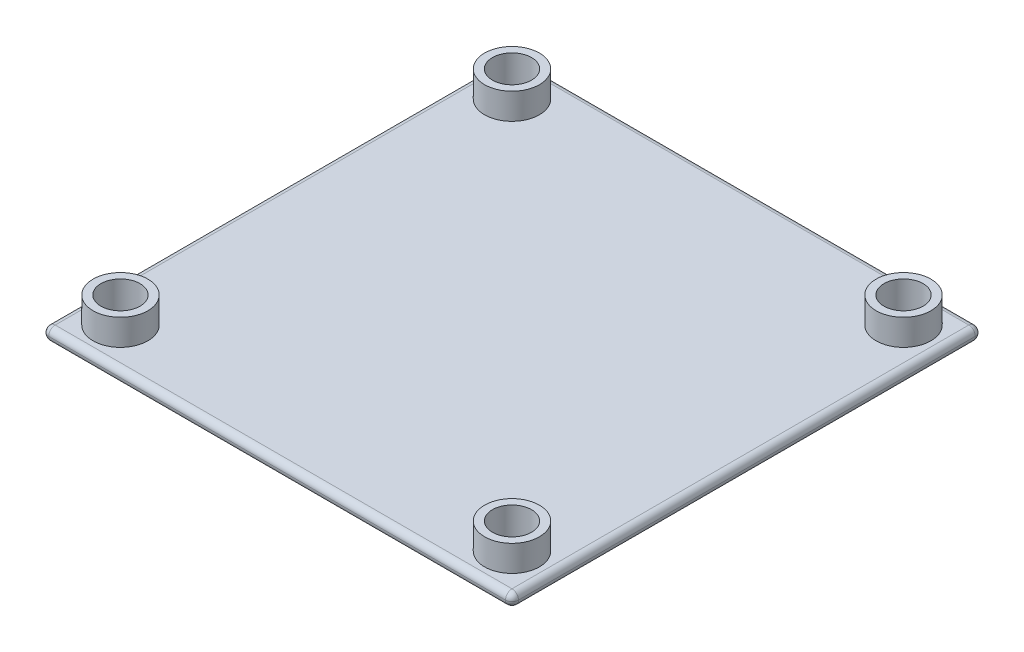
ISO-10303-21;
HEADER;
FILE_DESCRIPTION(('STEP AP214'),'2;1');
FILE_NAME('part.step','',(''),(''),'','','');
FILE_SCHEMA(('AUTOMOTIVE_DESIGN { 1 0 10303 214 1 1 1 1 }'));
ENDSEC;
DATA;
#1=APPLICATION_CONTEXT('core data for automotive mechanical design processes');
#2=APPLICATION_PROTOCOL_DEFINITION('international standard','automotive_design',2000,#1);
#3=PRODUCT_CONTEXT('',#1,'mechanical');
#4=PRODUCT('Part','Part','',(#3));
#5=PRODUCT_RELATED_PRODUCT_CATEGORY('part','',(#4));
#6=PRODUCT_DEFINITION_FORMATION('','',#4);
#7=PRODUCT_DEFINITION_CONTEXT('part definition',#1,'design');
#8=PRODUCT_DEFINITION('design','',#6,#7);
#9=PRODUCT_DEFINITION_SHAPE('','',#8);
#10=(LENGTH_UNIT() NAMED_UNIT(*) SI_UNIT(.MILLI.,.METRE.));
#11=(NAMED_UNIT(*) PLANE_ANGLE_UNIT() SI_UNIT($,.RADIAN.));
#12=(NAMED_UNIT(*) SI_UNIT($,.STERADIAN.) SOLID_ANGLE_UNIT());
#13=UNCERTAINTY_MEASURE_WITH_UNIT(LENGTH_MEASURE(1.E-05),#10,'distance_accuracy_value','');
#14=(GEOMETRIC_REPRESENTATION_CONTEXT(3) GLOBAL_UNCERTAINTY_ASSIGNED_CONTEXT((#13)) GLOBAL_UNIT_ASSIGNED_CONTEXT((#10,
#11,#12)) REPRESENTATION_CONTEXT('',''));
#15=CARTESIAN_POINT('',(0.,0.,0.));
#16=DIRECTION('',(0.,0.,1.));
#17=DIRECTION('',(1.,0.,0.));
#18=AXIS2_PLACEMENT_3D('',#15,#16,#17);
#19=CARTESIAN_POINT('',(0.,1.,0.));
#20=DIRECTION('',(0.,-1.,0.));
#21=DIRECTION('',(0.,0.,-1.));
#22=AXIS2_PLACEMENT_3D('',#19,#20,#21);
#23=PLANE('',#22);
#24=CARTESIAN_POINT('',(15.,1.,-15.));
#25=DIRECTION('',(0.,-1.,0.));
#26=DIRECTION('',(0.,0.,-1.));
#27=AXIS2_PLACEMENT_3D('',#24,#25,#26);
#28=CIRCLE('',#27,2.1);
#29=CARTESIAN_POINT('',(15.,1.,-17.1));
#30=VERTEX_POINT('',#29);
#31=EDGE_CURVE('E43',#30,#30,#28,.F.);
#32=ORIENTED_EDGE('',*,*,#31,.F.);
#33=EDGE_LOOP('',(#32));
#34=FACE_BOUND('',#33,.T.);
#35=CARTESIAN_POINT('',(-15.,1.,15.));
#36=DIRECTION('',(0.,-1.,0.));
#37=DIRECTION('',(0.,0.,-1.));
#38=AXIS2_PLACEMENT_3D('',#35,#36,#37);
#39=CIRCLE('',#38,2.1);
#40=CARTESIAN_POINT('',(-15.,1.,12.9));
#41=VERTEX_POINT('',#40);
#42=EDGE_CURVE('E142',#41,#41,#39,.F.);
#43=ORIENTED_EDGE('',*,*,#42,.F.);
#44=EDGE_LOOP('',(#43));
#45=FACE_BOUND('',#44,.T.);
#46=DIRECTION('',(0.,0.,-1.));
#47=VECTOR('',#46,1.);
#48=CARTESIAN_POINT('',(17.5,1.,0.));
#49=LINE('',#48,#47);
#50=CARTESIAN_POINT('',(17.5,1.,17.5));
#51=VERTEX_POINT('',#50);
#52=CARTESIAN_POINT('',(17.5,1.,-17.5));
#53=VERTEX_POINT('',#52);
#54=EDGE_CURVE('E213',#51,#53,#49,.T.);
#55=ORIENTED_EDGE('',*,*,#54,.T.);
#56=DIRECTION('',(-1.,0.,0.));
#57=VECTOR('',#56,1.);
#58=CARTESIAN_POINT('',(0.,1.,-17.5));
#59=LINE('',#58,#57);
#60=CARTESIAN_POINT('',(-17.5,1.,-17.5));
#61=VERTEX_POINT('',#60);
#62=EDGE_CURVE('E117',#53,#61,#59,.T.);
#63=ORIENTED_EDGE('',*,*,#62,.T.);
#64=DIRECTION('',(0.,0.,1.));
#65=VECTOR('',#64,1.);
#66=CARTESIAN_POINT('',(-17.5,1.,0.));
#67=LINE('',#66,#65);
#68=CARTESIAN_POINT('',(-17.5,1.,17.5));
#69=VERTEX_POINT('',#68);
#70=EDGE_CURVE('E94',#61,#69,#67,.T.);
#71=ORIENTED_EDGE('',*,*,#70,.T.);
#72=DIRECTION('',(1.,0.,0.));
#73=VECTOR('',#72,1.);
#74=CARTESIAN_POINT('',(0.,1.,17.5));
#75=LINE('',#74,#73);
#76=EDGE_CURVE('E334',#69,#51,#75,.T.);
#77=ORIENTED_EDGE('',*,*,#76,.T.);
#78=EDGE_LOOP('',(#55,#63,#71,#77));
#79=FACE_BOUND('',#78,.T.);
#80=CARTESIAN_POINT('',(-15.,1.,-15.));
#81=DIRECTION('',(0.,-1.,0.));
#82=DIRECTION('',(0.,0.,-1.));
#83=AXIS2_PLACEMENT_3D('',#80,#81,#82);
#84=CIRCLE('',#83,2.1);
#85=CARTESIAN_POINT('',(-15.,1.,-17.1));
#86=VERTEX_POINT('',#85);
#87=EDGE_CURVE('E200',#86,#86,#84,.F.);
#88=ORIENTED_EDGE('',*,*,#87,.F.);
#89=EDGE_LOOP('',(#88));
#90=FACE_BOUND('',#89,.T.);
#91=CARTESIAN_POINT('',(15.,1.,15.));
#92=DIRECTION('',(0.,-1.,0.));
#93=DIRECTION('',(0.,0.,-1.));
#94=AXIS2_PLACEMENT_3D('',#91,#92,#93);
#95=CIRCLE('',#94,2.1);
#96=CARTESIAN_POINT('',(15.,1.,12.9));
#97=VERTEX_POINT('',#96);
#98=EDGE_CURVE('E11',#97,#97,#95,.F.);
#99=ORIENTED_EDGE('',*,*,#98,.F.);
#100=EDGE_LOOP('',(#99));
#101=FACE_BOUND('',#100,.T.);
#102=ADVANCED_FACE('F34',(#34,#45,#79,#90,#101),#23,.F.);
#103=CARTESIAN_POINT('',(0.,0.,0.));
#104=DIRECTION('',(0.,-1.,0.));
#105=DIRECTION('',(0.,0.,-1.));
#106=AXIS2_PLACEMENT_3D('',#103,#104,#105);
#107=PLANE('',#106);
#108=DIRECTION('',(0.,0.,1.));
#109=VECTOR('',#108,1.);
#110=CARTESIAN_POINT('',(-17.5,0.,-18.));
#111=LINE('',#110,#109);
#112=CARTESIAN_POINT('',(-17.5,0.,17.5));
#113=VERTEX_POINT('',#112);
#114=CARTESIAN_POINT('',(-17.5,0.,-17.5));
#115=VERTEX_POINT('',#114);
#116=EDGE_CURVE('E113',#113,#115,#111,.F.);
#117=ORIENTED_EDGE('',*,*,#116,.T.);
#118=DIRECTION('',(-1.,0.,0.));
#119=VECTOR('',#118,1.);
#120=CARTESIAN_POINT('',(18.,0.,-17.5));
#121=LINE('',#120,#119);
#122=CARTESIAN_POINT('',(17.5,0.,-17.5));
#123=VERTEX_POINT('',#122);
#124=EDGE_CURVE('E137',#115,#123,#121,.F.);
#125=ORIENTED_EDGE('',*,*,#124,.T.);
#126=DIRECTION('',(0.,0.,-1.));
#127=VECTOR('',#126,1.);
#128=CARTESIAN_POINT('',(17.5,0.,18.));
#129=LINE('',#128,#127);
#130=CARTESIAN_POINT('',(17.5,0.,17.5));
#131=VERTEX_POINT('',#130);
#132=EDGE_CURVE('E116',#123,#131,#129,.F.);
#133=ORIENTED_EDGE('',*,*,#132,.T.);
#134=DIRECTION('',(1.,0.,0.));
#135=VECTOR('',#134,1.);
#136=CARTESIAN_POINT('',(-18.,0.,17.5));
#137=LINE('',#136,#135);
#138=EDGE_CURVE('E108',#131,#113,#137,.F.);
#139=ORIENTED_EDGE('',*,*,#138,.T.);
#140=EDGE_LOOP('',(#117,#125,#133,#139));
#141=FACE_BOUND('',#140,.T.);
#142=CARTESIAN_POINT('',(15.,0.,15.));
#143=DIRECTION('',(0.,1.,0.));
#144=DIRECTION('',(0.,0.,1.));
#145=AXIS2_PLACEMENT_3D('',#142,#143,#144);
#146=CIRCLE('',#145,1.5);
#147=CARTESIAN_POINT('',(15.,0.,16.5));
#148=VERTEX_POINT('',#147);
#149=EDGE_CURVE('E344',#148,#148,#146,.T.);
#150=ORIENTED_EDGE('',*,*,#149,.T.);
#151=EDGE_LOOP('',(#150));
#152=FACE_BOUND('',#151,.T.);
#153=CARTESIAN_POINT('',(-15.,0.,-15.));
#154=DIRECTION('',(0.,1.,0.));
#155=DIRECTION('',(0.,0.,1.));
#156=AXIS2_PLACEMENT_3D('',#153,#154,#155);
#157=CIRCLE('',#156,1.5);
#158=CARTESIAN_POINT('',(-15.,0.,-13.5));
#159=VERTEX_POINT('',#158);
#160=EDGE_CURVE('E338',#159,#159,#157,.T.);
#161=ORIENTED_EDGE('',*,*,#160,.T.);
#162=EDGE_LOOP('',(#161));
#163=FACE_BOUND('',#162,.T.);
#164=CARTESIAN_POINT('',(-15.,0.,15.));
#165=DIRECTION('',(0.,1.,0.));
#166=DIRECTION('',(0.,0.,1.));
#167=AXIS2_PLACEMENT_3D('',#164,#165,#166);
#168=CIRCLE('',#167,1.5);
#169=CARTESIAN_POINT('',(-15.,0.,16.5));
#170=VERTEX_POINT('',#169);
#171=EDGE_CURVE('E341',#170,#170,#168,.T.);
#172=ORIENTED_EDGE('',*,*,#171,.T.);
#173=EDGE_LOOP('',(#172));
#174=FACE_BOUND('',#173,.T.);
#175=CARTESIAN_POINT('',(15.,0.,-15.));
#176=DIRECTION('',(0.,1.,0.));
#177=DIRECTION('',(0.,0.,1.));
#178=AXIS2_PLACEMENT_3D('',#175,#176,#177);
#179=CIRCLE('',#178,1.5);
#180=CARTESIAN_POINT('',(15.,0.,-13.5));
#181=VERTEX_POINT('',#180);
#182=EDGE_CURVE('E197',#181,#181,#179,.T.);
#183=ORIENTED_EDGE('',*,*,#182,.T.);
#184=EDGE_LOOP('',(#183));
#185=FACE_BOUND('',#184,.T.);
#186=ADVANCED_FACE('F109',(#141,#152,#163,#174,#185),#107,.T.);
#187=CARTESIAN_POINT('',(-15.,1.,-15.));
#188=DIRECTION('',(0.,-1.,0.));
#189=DIRECTION('',(0.,0.,-1.));
#190=AXIS2_PLACEMENT_3D('',#187,#188,#189);
#191=CYLINDRICAL_SURFACE('',#190,1.5);
#192=ORIENTED_EDGE('',*,*,#160,.F.);
#193=EDGE_LOOP('',(#192));
#194=FACE_BOUND('',#193,.T.);
#195=CARTESIAN_POINT('',(-15.,3.,-15.));
#196=DIRECTION('',(0.,1.,0.));
#197=DIRECTION('',(0.,0.,1.));
#198=AXIS2_PLACEMENT_3D('',#195,#196,#197);
#199=CIRCLE('',#198,1.5);
#200=CARTESIAN_POINT('',(-15.,3.,-13.5));
#201=VERTEX_POINT('',#200);
#202=EDGE_CURVE('E357',#201,#201,#199,.T.);
#203=ORIENTED_EDGE('',*,*,#202,.T.);
#204=EDGE_LOOP('',(#203));
#205=FACE_BOUND('',#204,.T.);
#206=ADVANCED_FACE('F266',(#194,#205),#191,.F.);
#207=CARTESIAN_POINT('',(-15.,1.,15.));
#208=DIRECTION('',(0.,-1.,0.));
#209=DIRECTION('',(0.,0.,-1.));
#210=AXIS2_PLACEMENT_3D('',#207,#208,#209);
#211=CYLINDRICAL_SURFACE('',#210,1.5);
#212=ORIENTED_EDGE('',*,*,#171,.F.);
#213=EDGE_LOOP('',(#212));
#214=FACE_BOUND('',#213,.T.);
#215=CARTESIAN_POINT('',(-15.,3.,15.));
#216=DIRECTION('',(0.,1.,0.));
#217=DIRECTION('',(0.,0.,1.));
#218=AXIS2_PLACEMENT_3D('',#215,#216,#217);
#219=CIRCLE('',#218,1.5);
#220=CARTESIAN_POINT('',(-15.,3.,16.5));
#221=VERTEX_POINT('',#220);
#222=EDGE_CURVE('E351',#221,#221,#219,.T.);
#223=ORIENTED_EDGE('',*,*,#222,.T.);
#224=EDGE_LOOP('',(#223));
#225=FACE_BOUND('',#224,.T.);
#226=ADVANCED_FACE('F262',(#214,#225),#211,.F.);
#227=CARTESIAN_POINT('',(15.,1.,15.));
#228=DIRECTION('',(0.,-1.,0.));
#229=DIRECTION('',(0.,0.,-1.));
#230=AXIS2_PLACEMENT_3D('',#227,#228,#229);
#231=CYLINDRICAL_SURFACE('',#230,1.5);
#232=ORIENTED_EDGE('',*,*,#149,.F.);
#233=EDGE_LOOP('',(#232));
#234=FACE_BOUND('',#233,.T.);
#235=CARTESIAN_POINT('',(15.,3.,15.));
#236=DIRECTION('',(0.,1.,0.));
#237=DIRECTION('',(0.,0.,1.));
#238=AXIS2_PLACEMENT_3D('',#235,#236,#237);
#239=CIRCLE('',#238,1.5);
#240=CARTESIAN_POINT('',(15.,3.,16.5));
#241=VERTEX_POINT('',#240);
#242=EDGE_CURVE('E369',#241,#241,#239,.T.);
#243=ORIENTED_EDGE('',*,*,#242,.T.);
#244=EDGE_LOOP('',(#243));
#245=FACE_BOUND('',#244,.T.);
#246=ADVANCED_FACE('F258',(#234,#245),#231,.F.);
#247=CARTESIAN_POINT('',(15.,1.,-15.));
#248=DIRECTION('',(0.,-1.,0.));
#249=DIRECTION('',(0.,0.,-1.));
#250=AXIS2_PLACEMENT_3D('',#247,#248,#249);
#251=CYLINDRICAL_SURFACE('',#250,1.5);
#252=ORIENTED_EDGE('',*,*,#182,.F.);
#253=EDGE_LOOP('',(#252));
#254=FACE_BOUND('',#253,.T.);
#255=CARTESIAN_POINT('',(15.,3.,-15.));
#256=DIRECTION('',(0.,1.,0.));
#257=DIRECTION('',(0.,0.,1.));
#258=AXIS2_PLACEMENT_3D('',#255,#256,#257);
#259=CIRCLE('',#258,1.5);
#260=CARTESIAN_POINT('',(15.,3.,-13.5));
#261=VERTEX_POINT('',#260);
#262=EDGE_CURVE('E363',#261,#261,#259,.T.);
#263=ORIENTED_EDGE('',*,*,#262,.T.);
#264=EDGE_LOOP('',(#263));
#265=FACE_BOUND('',#264,.T.);
#266=ADVANCED_FACE('F255',(#254,#265),#251,.F.);
#267=CARTESIAN_POINT('',(-18.,0.5,17.5));
#268=DIRECTION('',(-1.,0.,0.));
#269=DIRECTION('',(0.,0.,1.));
#270=AXIS2_PLACEMENT_3D('',#267,#268,#269);
#271=CYLINDRICAL_SURFACE('',#270,0.5);
#272=CARTESIAN_POINT('',(17.5,0.5,17.5));
#273=DIRECTION('',(1.,0.,0.));
#274=DIRECTION('',(0.,0.,-1.));
#275=AXIS2_PLACEMENT_3D('',#272,#273,#274);
#276=CIRCLE('',#275,0.5);
#277=CARTESIAN_POINT('',(17.5,0.5,18.));
#278=VERTEX_POINT('',#277);
#279=EDGE_CURVE('E80',#278,#131,#276,.T.);
#280=ORIENTED_EDGE('',*,*,#279,.F.);
#281=DIRECTION('',(1.,0.,0.));
#282=VECTOR('',#281,1.);
#283=CARTESIAN_POINT('',(18.,0.5,18.));
#284=LINE('',#283,#282);
#285=CARTESIAN_POINT('',(-17.5,0.5,18.));
#286=VERTEX_POINT('',#285);
#287=EDGE_CURVE('E85',#286,#278,#284,.T.);
#288=ORIENTED_EDGE('',*,*,#287,.F.);
#289=CARTESIAN_POINT('',(-17.5,0.5,17.5));
#290=DIRECTION('',(-1.,0.,0.));
#291=DIRECTION('',(0.,0.,1.));
#292=AXIS2_PLACEMENT_3D('',#289,#290,#291);
#293=CIRCLE('',#292,0.5);
#294=EDGE_CURVE('E120',#113,#286,#293,.T.);
#295=ORIENTED_EDGE('',*,*,#294,.F.);
#296=ORIENTED_EDGE('',*,*,#138,.F.);
#297=EDGE_LOOP('',(#280,#288,#295,#296));
#298=FACE_BOUND('',#297,.T.);
#299=ADVANCED_FACE('F36',(#298),#271,.T.);
#300=CARTESIAN_POINT('',(17.5,0.5,17.5));
#301=DIRECTION('',(0.,0.,1.));
#302=DIRECTION('',(1.,0.,0.));
#303=AXIS2_PLACEMENT_3D('',#300,#301,#302);
#304=SPHERICAL_SURFACE('',#303,0.5);
#305=CARTESIAN_POINT('',(17.5,0.5,17.5));
#306=DIRECTION('',(0.,-1.,0.));
#307=DIRECTION('',(0.,0.,-1.));
#308=AXIS2_PLACEMENT_3D('',#305,#306,#307);
#309=CIRCLE('',#308,0.5);
#310=CARTESIAN_POINT('',(18.,0.5,17.5));
#311=VERTEX_POINT('',#310);
#312=EDGE_CURVE('E193',#278,#311,#309,.F.);
#313=ORIENTED_EDGE('',*,*,#312,.F.);
#314=ORIENTED_EDGE('',*,*,#279,.T.);
#315=CARTESIAN_POINT('',(17.5,0.5,17.5));
#316=DIRECTION('',(0.,0.,1.));
#317=DIRECTION('',(1.,0.,0.));
#318=AXIS2_PLACEMENT_3D('',#315,#316,#317);
#319=CIRCLE('',#318,0.5);
#320=EDGE_CURVE('E123',#311,#131,#319,.F.);
#321=ORIENTED_EDGE('',*,*,#320,.F.);
#322=EDGE_LOOP('',(#313,#314,#321));
#323=FACE_BOUND('',#322,.T.);
#324=ADVANCED_FACE('F321',(#323),#304,.T.);
#325=CARTESIAN_POINT('',(0.,0.5,17.5));
#326=DIRECTION('',(1.,0.,0.));
#327=DIRECTION('',(0.,0.,-1.));
#328=AXIS2_PLACEMENT_3D('',#325,#326,#327);
#329=CYLINDRICAL_SURFACE('',#328,0.5);
#330=CARTESIAN_POINT('',(-17.5,0.5,17.5));
#331=DIRECTION('',(-1.,0.,0.));
#332=DIRECTION('',(0.,0.,1.));
#333=AXIS2_PLACEMENT_3D('',#330,#331,#332);
#334=CIRCLE('',#333,0.5);
#335=EDGE_CURVE('E184',#286,#69,#334,.T.);
#336=ORIENTED_EDGE('',*,*,#335,.F.);
#337=ORIENTED_EDGE('',*,*,#287,.T.);
#338=CARTESIAN_POINT('',(17.5,0.5,17.5));
#339=DIRECTION('',(1.,0.,0.));
#340=DIRECTION('',(0.,0.,-1.));
#341=AXIS2_PLACEMENT_3D('',#338,#339,#340);
#342=CIRCLE('',#341,0.5);
#343=EDGE_CURVE('E187',#51,#278,#342,.T.);
#344=ORIENTED_EDGE('',*,*,#343,.F.);
#345=ORIENTED_EDGE('',*,*,#76,.F.);
#346=EDGE_LOOP('',(#336,#337,#344,#345));
#347=FACE_BOUND('',#346,.T.);
#348=ADVANCED_FACE('F319',(#347),#329,.T.);
#349=CARTESIAN_POINT('',(-17.5,0.5,17.5));
#350=DIRECTION('',(0.,0.,1.));
#351=DIRECTION('',(1.,0.,0.));
#352=AXIS2_PLACEMENT_3D('',#349,#350,#351);
#353=SPHERICAL_SURFACE('',#352,0.5);
#354=ORIENTED_EDGE('',*,*,#294,.T.);
#355=CARTESIAN_POINT('',(-17.5,0.5,17.5));
#356=DIRECTION('',(0.,1.,0.));
#357=DIRECTION('',(0.,0.,1.));
#358=AXIS2_PLACEMENT_3D('',#355,#356,#357);
#359=CIRCLE('',#358,0.5);
#360=CARTESIAN_POINT('',(-18.,0.5,17.5));
#361=VERTEX_POINT('',#360);
#362=EDGE_CURVE('E128',#361,#286,#359,.T.);
#363=ORIENTED_EDGE('',*,*,#362,.F.);
#364=CARTESIAN_POINT('',(-17.5,0.5,17.5));
#365=DIRECTION('',(0.,0.,1.));
#366=DIRECTION('',(1.,0.,0.));
#367=AXIS2_PLACEMENT_3D('',#364,#365,#366);
#368=CIRCLE('',#367,0.5);
#369=EDGE_CURVE('E126',#113,#361,#368,.F.);
#370=ORIENTED_EDGE('',*,*,#369,.F.);
#371=EDGE_LOOP('',(#354,#363,#370));
#372=FACE_BOUND('',#371,.T.);
#373=ADVANCED_FACE('F127',(#372),#353,.T.);
#374=CARTESIAN_POINT('',(17.5,0.5,18.));
#375=DIRECTION('',(0.,0.,1.));
#376=DIRECTION('',(1.,0.,0.));
#377=AXIS2_PLACEMENT_3D('',#374,#375,#376);
#378=CYLINDRICAL_SURFACE('',#377,0.5);
#379=ORIENTED_EDGE('',*,*,#320,.T.);
#380=ORIENTED_EDGE('',*,*,#132,.F.);
#381=CARTESIAN_POINT('',(17.5,0.5,-17.5));
#382=DIRECTION('',(0.,0.,-1.));
#383=DIRECTION('',(-1.,0.,0.));
#384=AXIS2_PLACEMENT_3D('',#381,#382,#383);
#385=CIRCLE('',#384,0.5);
#386=CARTESIAN_POINT('',(18.,0.5,-17.5));
#387=VERTEX_POINT('',#386);
#388=EDGE_CURVE('E180',#387,#123,#385,.T.);
#389=ORIENTED_EDGE('',*,*,#388,.F.);
#390=DIRECTION('',(0.,0.,-1.));
#391=VECTOR('',#390,1.);
#392=CARTESIAN_POINT('',(18.,0.5,-18.));
#393=LINE('',#392,#391);
#394=EDGE_CURVE('E174',#311,#387,#393,.T.);
#395=ORIENTED_EDGE('',*,*,#394,.F.);
#396=EDGE_LOOP('',(#379,#380,#389,#395));
#397=FACE_BOUND('',#396,.T.);
#398=ADVANCED_FACE('F312',(#397),#378,.T.);
#399=CARTESIAN_POINT('',(17.5,0.5,17.5));
#400=DIRECTION('',(0.,0.,1.));
#401=DIRECTION('',(1.,0.,0.));
#402=AXIS2_PLACEMENT_3D('',#399,#400,#401);
#403=SPHERICAL_SURFACE('',#402,0.5);
#404=ORIENTED_EDGE('',*,*,#343,.T.);
#405=ORIENTED_EDGE('',*,*,#312,.T.);
#406=CARTESIAN_POINT('',(17.5,0.5,17.5));
#407=DIRECTION('',(0.,0.,1.));
#408=DIRECTION('',(1.,0.,0.));
#409=AXIS2_PLACEMENT_3D('',#406,#407,#408);
#410=CIRCLE('',#409,0.5);
#411=EDGE_CURVE('E171',#51,#311,#410,.F.);
#412=ORIENTED_EDGE('',*,*,#411,.F.);
#413=EDGE_LOOP('',(#404,#405,#412));
#414=FACE_BOUND('',#413,.T.);
#415=ADVANCED_FACE('F308',(#414),#403,.T.);
#416=CARTESIAN_POINT('',(-17.5,0.5,17.5));
#417=DIRECTION('',(0.,0.,1.));
#418=DIRECTION('',(1.,0.,0.));
#419=AXIS2_PLACEMENT_3D('',#416,#417,#418);
#420=SPHERICAL_SURFACE('',#419,0.5);
#421=ORIENTED_EDGE('',*,*,#362,.T.);
#422=ORIENTED_EDGE('',*,*,#335,.T.);
#423=CARTESIAN_POINT('',(-17.5,0.5,17.5));
#424=DIRECTION('',(0.,0.,1.));
#425=DIRECTION('',(1.,0.,0.));
#426=AXIS2_PLACEMENT_3D('',#423,#424,#425);
#427=CIRCLE('',#426,0.5);
#428=EDGE_CURVE('E168',#361,#69,#427,.F.);
#429=ORIENTED_EDGE('',*,*,#428,.F.);
#430=EDGE_LOOP('',(#421,#422,#429));
#431=FACE_BOUND('',#430,.T.);
#432=ADVANCED_FACE('F305',(#431),#420,.T.);
#433=CARTESIAN_POINT('',(-17.5,0.5,18.));
#434=DIRECTION('',(0.,0.,-1.));
#435=DIRECTION('',(-1.,0.,0.));
#436=AXIS2_PLACEMENT_3D('',#433,#434,#435);
#437=CYLINDRICAL_SURFACE('',#436,0.5);
#438=CARTESIAN_POINT('',(-17.5,0.5,-17.5));
#439=DIRECTION('',(0.,0.,-1.));
#440=DIRECTION('',(-1.,0.,0.));
#441=AXIS2_PLACEMENT_3D('',#438,#439,#440);
#442=CIRCLE('',#441,0.5);
#443=CARTESIAN_POINT('',(-18.,0.5,-17.5));
#444=VERTEX_POINT('',#443);
#445=EDGE_CURVE('E132',#115,#444,#442,.T.);
#446=ORIENTED_EDGE('',*,*,#445,.F.);
#447=ORIENTED_EDGE('',*,*,#116,.F.);
#448=ORIENTED_EDGE('',*,*,#369,.T.);
#449=DIRECTION('',(0.,0.,1.));
#450=VECTOR('',#449,1.);
#451=CARTESIAN_POINT('',(-18.,0.5,18.));
#452=LINE('',#451,#450);
#453=EDGE_CURVE('E165',#444,#361,#452,.T.);
#454=ORIENTED_EDGE('',*,*,#453,.F.);
#455=EDGE_LOOP('',(#446,#447,#448,#454));
#456=FACE_BOUND('',#455,.T.);
#457=ADVANCED_FACE('F134',(#456),#437,.T.);
#458=CARTESIAN_POINT('',(-17.5,0.5,-17.5));
#459=DIRECTION('',(0.,0.,1.));
#460=DIRECTION('',(1.,0.,0.));
#461=AXIS2_PLACEMENT_3D('',#458,#459,#460);
#462=SPHERICAL_SURFACE('',#461,0.5);
#463=CARTESIAN_POINT('',(-17.5,0.5,-17.5));
#464=DIRECTION('',(-1.,0.,0.));
#465=DIRECTION('',(0.,0.,1.));
#466=AXIS2_PLACEMENT_3D('',#463,#464,#465);
#467=CIRCLE('',#466,0.5);
#468=CARTESIAN_POINT('',(-17.5,0.5,-18.));
#469=VERTEX_POINT('',#468);
#470=EDGE_CURVE('E159',#115,#469,#467,.F.);
#471=ORIENTED_EDGE('',*,*,#470,.F.);
#472=ORIENTED_EDGE('',*,*,#445,.T.);
#473=CARTESIAN_POINT('',(-17.5,0.5,-17.5));
#474=DIRECTION('',(0.,-1.,0.));
#475=DIRECTION('',(0.,0.,-1.));
#476=AXIS2_PLACEMENT_3D('',#473,#474,#475);
#477=CIRCLE('',#476,0.5);
#478=EDGE_CURVE('E162',#469,#444,#477,.F.);
#479=ORIENTED_EDGE('',*,*,#478,.F.);
#480=EDGE_LOOP('',(#471,#472,#479));
#481=FACE_BOUND('',#480,.T.);
#482=ADVANCED_FACE('F298',(#481),#462,.T.);
#483=CARTESIAN_POINT('',(17.5,0.5,-17.5));
#484=DIRECTION('',(0.,0.,1.));
#485=DIRECTION('',(1.,0.,0.));
#486=AXIS2_PLACEMENT_3D('',#483,#484,#485);
#487=SPHERICAL_SURFACE('',#486,0.5);
#488=CARTESIAN_POINT('',(17.5,0.5,-17.5));
#489=DIRECTION('',(0.,-1.,0.));
#490=DIRECTION('',(0.,0.,-1.));
#491=AXIS2_PLACEMENT_3D('',#488,#489,#490);
#492=CIRCLE('',#491,0.5);
#493=CARTESIAN_POINT('',(17.5,0.5,-18.));
#494=VERTEX_POINT('',#493);
#495=EDGE_CURVE('E177',#387,#494,#492,.F.);
#496=ORIENTED_EDGE('',*,*,#495,.F.);
#497=ORIENTED_EDGE('',*,*,#388,.T.);
#498=CARTESIAN_POINT('',(17.5,0.5,-17.5));
#499=DIRECTION('',(1.,0.,0.));
#500=DIRECTION('',(0.,0.,-1.));
#501=AXIS2_PLACEMENT_3D('',#498,#499,#500);
#502=CIRCLE('',#501,0.5);
#503=EDGE_CURVE('E51',#494,#123,#502,.F.);
#504=ORIENTED_EDGE('',*,*,#503,.F.);
#505=EDGE_LOOP('',(#496,#497,#504));
#506=FACE_BOUND('',#505,.T.);
#507=ADVANCED_FACE('F294',(#506),#487,.T.);
#508=CARTESIAN_POINT('',(17.5,0.5,0.));
#509=DIRECTION('',(0.,0.,-1.));
#510=DIRECTION('',(-1.,0.,0.));
#511=AXIS2_PLACEMENT_3D('',#508,#509,#510);
#512=CYLINDRICAL_SURFACE('',#511,0.5);
#513=ORIENTED_EDGE('',*,*,#411,.T.);
#514=ORIENTED_EDGE('',*,*,#394,.T.);
#515=CARTESIAN_POINT('',(17.5,0.5,-17.5));
#516=DIRECTION('',(0.,0.,-1.));
#517=DIRECTION('',(-1.,0.,0.));
#518=AXIS2_PLACEMENT_3D('',#515,#516,#517);
#519=CIRCLE('',#518,0.5);
#520=EDGE_CURVE('E155',#53,#387,#519,.T.);
#521=ORIENTED_EDGE('',*,*,#520,.F.);
#522=ORIENTED_EDGE('',*,*,#54,.F.);
#523=EDGE_LOOP('',(#513,#514,#521,#522));
#524=FACE_BOUND('',#523,.T.);
#525=ADVANCED_FACE('F290',(#524),#512,.T.);
#526=CARTESIAN_POINT('',(-17.5,0.5,0.));
#527=DIRECTION('',(0.,0.,1.));
#528=DIRECTION('',(1.,0.,0.));
#529=AXIS2_PLACEMENT_3D('',#526,#527,#528);
#530=CYLINDRICAL_SURFACE('',#529,0.5);
#531=ORIENTED_EDGE('',*,*,#428,.T.);
#532=ORIENTED_EDGE('',*,*,#70,.F.);
#533=CARTESIAN_POINT('',(-17.5,0.5,-17.5));
#534=DIRECTION('',(0.,0.,-1.));
#535=DIRECTION('',(-1.,0.,0.));
#536=AXIS2_PLACEMENT_3D('',#533,#534,#535);
#537=CIRCLE('',#536,0.5);
#538=EDGE_CURVE('E152',#444,#61,#537,.T.);
#539=ORIENTED_EDGE('',*,*,#538,.F.);
#540=ORIENTED_EDGE('',*,*,#453,.T.);
#541=EDGE_LOOP('',(#531,#532,#539,#540));
#542=FACE_BOUND('',#541,.T.);
#543=ADVANCED_FACE('F287',(#542),#530,.T.);
#544=CARTESIAN_POINT('',(-18.,0.5,-17.5));
#545=DIRECTION('',(1.,0.,0.));
#546=DIRECTION('',(0.,0.,-1.));
#547=AXIS2_PLACEMENT_3D('',#544,#545,#546);
#548=CYLINDRICAL_SURFACE('',#547,0.5);
#549=ORIENTED_EDGE('',*,*,#124,.F.);
#550=ORIENTED_EDGE('',*,*,#470,.T.);
#551=DIRECTION('',(-1.,0.,0.));
#552=VECTOR('',#551,1.);
#553=CARTESIAN_POINT('',(-18.,0.5,-18.));
#554=LINE('',#553,#552);
#555=EDGE_CURVE('E149',#494,#469,#554,.T.);
#556=ORIENTED_EDGE('',*,*,#555,.F.);
#557=ORIENTED_EDGE('',*,*,#503,.T.);
#558=EDGE_LOOP('',(#549,#550,#556,#557));
#559=FACE_BOUND('',#558,.T.);
#560=ADVANCED_FACE('F283',(#559),#548,.T.);
#561=CARTESIAN_POINT('',(17.5,0.5,-17.5));
#562=DIRECTION('',(0.,0.,1.));
#563=DIRECTION('',(1.,0.,0.));
#564=AXIS2_PLACEMENT_3D('',#561,#562,#563);
#565=SPHERICAL_SURFACE('',#564,0.5);
#566=ORIENTED_EDGE('',*,*,#520,.T.);
#567=ORIENTED_EDGE('',*,*,#495,.T.);
#568=CARTESIAN_POINT('',(17.5,0.5,-17.5));
#569=DIRECTION('',(1.,0.,0.));
#570=DIRECTION('',(0.,0.,-1.));
#571=AXIS2_PLACEMENT_3D('',#568,#569,#570);
#572=CIRCLE('',#571,0.5);
#573=EDGE_CURVE('E145',#53,#494,#572,.F.);
#574=ORIENTED_EDGE('',*,*,#573,.F.);
#575=EDGE_LOOP('',(#566,#567,#574));
#576=FACE_BOUND('',#575,.T.);
#577=ADVANCED_FACE('F279',(#576),#565,.T.);
#578=CARTESIAN_POINT('',(-17.5,0.5,-17.5));
#579=DIRECTION('',(0.,0.,1.));
#580=DIRECTION('',(1.,0.,0.));
#581=AXIS2_PLACEMENT_3D('',#578,#579,#580);
#582=SPHERICAL_SURFACE('',#581,0.5);
#583=ORIENTED_EDGE('',*,*,#478,.T.);
#584=ORIENTED_EDGE('',*,*,#538,.T.);
#585=CARTESIAN_POINT('',(-17.5,0.5,-17.5));
#586=DIRECTION('',(-1.,0.,0.));
#587=DIRECTION('',(0.,0.,1.));
#588=AXIS2_PLACEMENT_3D('',#585,#586,#587);
#589=CIRCLE('',#588,0.5);
#590=EDGE_CURVE('E143',#469,#61,#589,.F.);
#591=ORIENTED_EDGE('',*,*,#590,.F.);
#592=EDGE_LOOP('',(#583,#584,#591));
#593=FACE_BOUND('',#592,.T.);
#594=ADVANCED_FACE('F275',(#593),#582,.T.);
#595=CARTESIAN_POINT('',(0.,0.5,-17.5));
#596=DIRECTION('',(-1.,0.,0.));
#597=DIRECTION('',(0.,0.,1.));
#598=AXIS2_PLACEMENT_3D('',#595,#596,#597);
#599=CYLINDRICAL_SURFACE('',#598,0.5);
#600=ORIENTED_EDGE('',*,*,#573,.T.);
#601=ORIENTED_EDGE('',*,*,#555,.T.);
#602=ORIENTED_EDGE('',*,*,#590,.T.);
#603=ORIENTED_EDGE('',*,*,#62,.F.);
#604=EDGE_LOOP('',(#600,#601,#602,#603));
#605=FACE_BOUND('',#604,.T.);
#606=ADVANCED_FACE('F250',(#605),#599,.T.);
#607=CARTESIAN_POINT('',(-15.,3.,15.));
#608=DIRECTION('',(0.,1.,0.));
#609=DIRECTION('',(0.,0.,1.));
#610=AXIS2_PLACEMENT_3D('',#607,#608,#609);
#611=PLANE('',#610);
#612=CARTESIAN_POINT('',(-15.,3.,15.));
#613=DIRECTION('',(0.,1.,0.));
#614=DIRECTION('',(0.,0.,1.));
#615=AXIS2_PLACEMENT_3D('',#612,#613,#614);
#616=CIRCLE('',#615,2.1);
#617=CARTESIAN_POINT('',(-15.,3.,17.1));
#618=VERTEX_POINT('',#617);
#619=EDGE_CURVE('E146',#618,#618,#616,.T.);
#620=ORIENTED_EDGE('',*,*,#619,.T.);
#621=EDGE_LOOP('',(#620));
#622=FACE_BOUND('',#621,.T.);
#623=ORIENTED_EDGE('',*,*,#222,.F.);
#624=EDGE_LOOP('',(#623));
#625=FACE_BOUND('',#624,.T.);
#626=ADVANCED_FACE('F247',(#622,#625),#611,.T.);
#627=CARTESIAN_POINT('',(-15.,3.,15.));
#628=DIRECTION('',(0.,-1.,0.));
#629=DIRECTION('',(0.,0.,-1.));
#630=AXIS2_PLACEMENT_3D('',#627,#628,#629);
#631=CYLINDRICAL_SURFACE('',#630,2.1);
#632=ORIENTED_EDGE('',*,*,#619,.F.);
#633=EDGE_LOOP('',(#632));
#634=FACE_BOUND('',#633,.T.);
#635=ORIENTED_EDGE('',*,*,#42,.T.);
#636=EDGE_LOOP('',(#635));
#637=FACE_BOUND('',#636,.T.);
#638=ADVANCED_FACE('F242',(#634,#637),#631,.T.);
#639=CARTESIAN_POINT('',(-15.,3.,-15.));
#640=DIRECTION('',(0.,1.,0.));
#641=DIRECTION('',(0.,0.,1.));
#642=AXIS2_PLACEMENT_3D('',#639,#640,#641);
#643=PLANE('',#642);
#644=CARTESIAN_POINT('',(-15.,3.,-15.));
#645=DIRECTION('',(0.,1.,0.));
#646=DIRECTION('',(0.,0.,1.));
#647=AXIS2_PLACEMENT_3D('',#644,#645,#646);
#648=CIRCLE('',#647,2.1);
#649=CARTESIAN_POINT('',(-15.,3.,-12.9));
#650=VERTEX_POINT('',#649);
#651=EDGE_CURVE('E354',#650,#650,#648,.T.);
#652=ORIENTED_EDGE('',*,*,#651,.T.);
#653=EDGE_LOOP('',(#652));
#654=FACE_BOUND('',#653,.T.);
#655=ORIENTED_EDGE('',*,*,#202,.F.);
#656=EDGE_LOOP('',(#655));
#657=FACE_BOUND('',#656,.T.);
#658=ADVANCED_FACE('F239',(#654,#657),#643,.T.);
#659=CARTESIAN_POINT('',(-15.,3.,-15.));
#660=DIRECTION('',(0.,-1.,0.));
#661=DIRECTION('',(0.,0.,-1.));
#662=AXIS2_PLACEMENT_3D('',#659,#660,#661);
#663=CYLINDRICAL_SURFACE('',#662,2.1);
#664=ORIENTED_EDGE('',*,*,#651,.F.);
#665=EDGE_LOOP('',(#664));
#666=FACE_BOUND('',#665,.T.);
#667=ORIENTED_EDGE('',*,*,#87,.T.);
#668=EDGE_LOOP('',(#667));
#669=FACE_BOUND('',#668,.T.);
#670=ADVANCED_FACE('F234',(#666,#669),#663,.T.);
#671=CARTESIAN_POINT('',(15.,3.,-15.));
#672=DIRECTION('',(0.,1.,0.));
#673=DIRECTION('',(0.,0.,1.));
#674=AXIS2_PLACEMENT_3D('',#671,#672,#673);
#675=PLANE('',#674);
#676=CARTESIAN_POINT('',(15.,3.,-15.));
#677=DIRECTION('',(0.,1.,0.));
#678=DIRECTION('',(0.,0.,1.));
#679=AXIS2_PLACEMENT_3D('',#676,#677,#678);
#680=CIRCLE('',#679,2.1);
#681=CARTESIAN_POINT('',(15.,3.,-12.9));
#682=VERTEX_POINT('',#681);
#683=EDGE_CURVE('E360',#682,#682,#680,.T.);
#684=ORIENTED_EDGE('',*,*,#683,.T.);
#685=EDGE_LOOP('',(#684));
#686=FACE_BOUND('',#685,.T.);
#687=ORIENTED_EDGE('',*,*,#262,.F.);
#688=EDGE_LOOP('',(#687));
#689=FACE_BOUND('',#688,.T.);
#690=ADVANCED_FACE('F231',(#686,#689),#675,.T.);
#691=CARTESIAN_POINT('',(15.,3.,-15.));
#692=DIRECTION('',(0.,-1.,0.));
#693=DIRECTION('',(0.,0.,-1.));
#694=AXIS2_PLACEMENT_3D('',#691,#692,#693);
#695=CYLINDRICAL_SURFACE('',#694,2.1);
#696=ORIENTED_EDGE('',*,*,#683,.F.);
#697=EDGE_LOOP('',(#696));
#698=FACE_BOUND('',#697,.T.);
#699=ORIENTED_EDGE('',*,*,#31,.T.);
#700=EDGE_LOOP('',(#699));
#701=FACE_BOUND('',#700,.T.);
#702=ADVANCED_FACE('F205',(#698,#701),#695,.T.);
#703=CARTESIAN_POINT('',(15.,3.,15.));
#704=DIRECTION('',(0.,1.,0.));
#705=DIRECTION('',(0.,0.,1.));
#706=AXIS2_PLACEMENT_3D('',#703,#704,#705);
#707=PLANE('',#706);
#708=CARTESIAN_POINT('',(15.,3.,15.));
#709=DIRECTION('',(0.,1.,0.));
#710=DIRECTION('',(0.,0.,1.));
#711=AXIS2_PLACEMENT_3D('',#708,#709,#710);
#712=CIRCLE('',#711,2.1);
#713=CARTESIAN_POINT('',(15.,3.,17.1));
#714=VERTEX_POINT('',#713);
#715=EDGE_CURVE('E366',#714,#714,#712,.T.);
#716=ORIENTED_EDGE('',*,*,#715,.T.);
#717=EDGE_LOOP('',(#716));
#718=FACE_BOUND('',#717,.T.);
#719=ORIENTED_EDGE('',*,*,#242,.F.);
#720=EDGE_LOOP('',(#719));
#721=FACE_BOUND('',#720,.T.);
#722=ADVANCED_FACE('F221',(#718,#721),#707,.T.);
#723=CARTESIAN_POINT('',(15.,3.,15.));
#724=DIRECTION('',(0.,-1.,0.));
#725=DIRECTION('',(0.,0.,-1.));
#726=AXIS2_PLACEMENT_3D('',#723,#724,#725);
#727=CYLINDRICAL_SURFACE('',#726,2.1);
#728=ORIENTED_EDGE('',*,*,#715,.F.);
#729=EDGE_LOOP('',(#728));
#730=FACE_BOUND('',#729,.T.);
#731=ORIENTED_EDGE('',*,*,#98,.T.);
#732=EDGE_LOOP('',(#731));
#733=FACE_BOUND('',#732,.T.);
#734=ADVANCED_FACE('F219',(#730,#733),#727,.T.);
#735=CLOSED_SHELL('',(#102,#186,#206,#226,#246,#266,#299,#324,#348,#373,#398,#415,#432,#457,
#482,#507,#525,#543,#560,#577,#594,#606,#626,#638,#658,#670,#690,#702,#722,#734));
#736=MANIFOLD_SOLID_BREP('B2',#735);
#737=ADVANCED_BREP_SHAPE_REPRESENTATION('',(#18,#736),#14);
#738=SHAPE_DEFINITION_REPRESENTATION(#9,#737);
ENDSEC;
END-ISO-10303-21;
